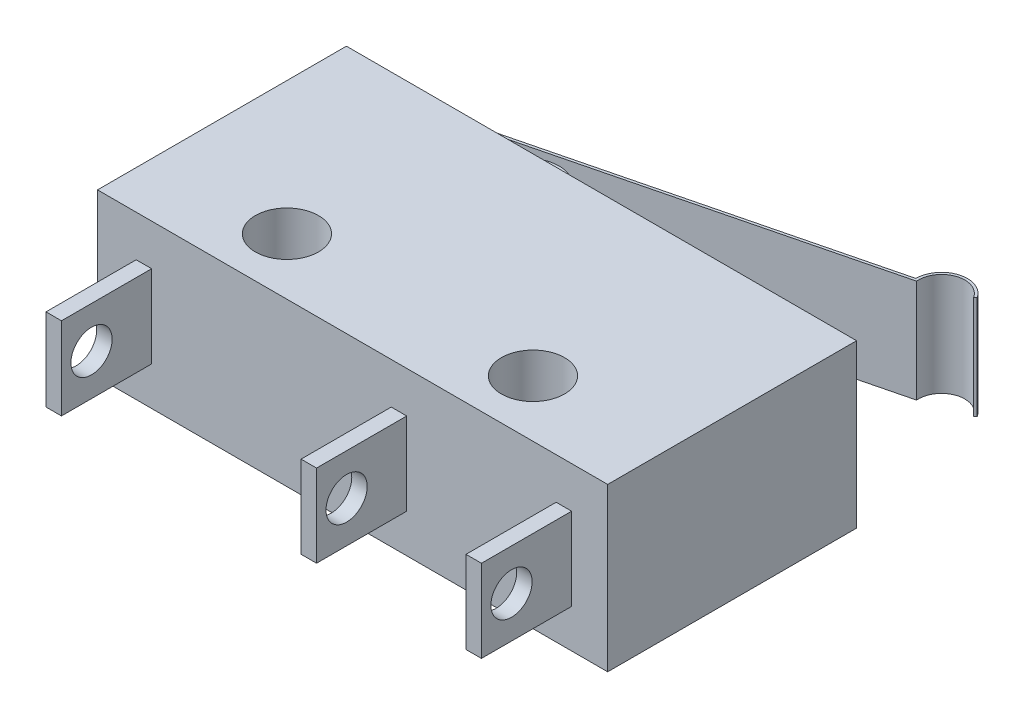
ISO-10303-21;
HEADER;
FILE_DESCRIPTION(('STEP AP214'),'2;1');
FILE_NAME('part.step','',(''),(''),'','','');
FILE_SCHEMA(('AUTOMOTIVE_DESIGN { 1 0 10303 214 1 1 1 1 }'));
ENDSEC;
DATA;
#1=APPLICATION_CONTEXT('core data for automotive mechanical design processes');
#2=APPLICATION_PROTOCOL_DEFINITION('international standard','automotive_design',2000,#1);
#3=PRODUCT_CONTEXT('',#1,'mechanical');
#4=PRODUCT('Part','Part','',(#3));
#5=PRODUCT_RELATED_PRODUCT_CATEGORY('part','',(#4));
#6=PRODUCT_DEFINITION_FORMATION('','',#4);
#7=PRODUCT_DEFINITION_CONTEXT('part definition',#1,'design');
#8=PRODUCT_DEFINITION('design','',#6,#7);
#9=PRODUCT_DEFINITION_SHAPE('','',#8);
#10=(LENGTH_UNIT() NAMED_UNIT(*) SI_UNIT(.MILLI.,.METRE.));
#11=(NAMED_UNIT(*) PLANE_ANGLE_UNIT() SI_UNIT($,.RADIAN.));
#12=(NAMED_UNIT(*) SI_UNIT($,.STERADIAN.) SOLID_ANGLE_UNIT());
#13=UNCERTAINTY_MEASURE_WITH_UNIT(LENGTH_MEASURE(1.E-05),#10,'distance_accuracy_value','');
#14=(GEOMETRIC_REPRESENTATION_CONTEXT(3) GLOBAL_UNCERTAINTY_ASSIGNED_CONTEXT((#13)) GLOBAL_UNIT_ASSIGNED_CONTEXT((#10,
#11,#12)) REPRESENTATION_CONTEXT('',''));
#15=CARTESIAN_POINT('',(0.,0.,0.));
#16=DIRECTION('',(0.,0.,1.));
#17=DIRECTION('',(1.,0.,0.));
#18=AXIS2_PLACEMENT_3D('',#15,#16,#17);
#19=CARTESIAN_POINT('',(-9.9,6.3,4.83));
#20=DIRECTION('',(0.,0.,-1.));
#21=DIRECTION('',(-1.,0.,0.));
#22=AXIS2_PLACEMENT_3D('',#19,#20,#21);
#23=PLANE('',#22);
#24=DIRECTION('',(0.,-1.,0.));
#25=VECTOR('',#24,1.);
#26=CARTESIAN_POINT('',(1.5,4.7,4.83));
#27=LINE('',#26,#25);
#28=CARTESIAN_POINT('',(1.5,4.7,4.83));
#29=VERTEX_POINT('',#28);
#30=CARTESIAN_POINT('',(1.5,1.5,4.83));
#31=VERTEX_POINT('',#30);
#32=EDGE_CURVE('E323',#29,#31,#27,.T.);
#33=ORIENTED_EDGE('',*,*,#32,.F.);
#34=DIRECTION('',(-1.,0.,0.));
#35=VECTOR('',#34,1.);
#36=CARTESIAN_POINT('',(1.5,4.7,4.83));
#37=LINE('',#36,#35);
#38=CARTESIAN_POINT('',(2.1,4.7,4.83));
#39=VERTEX_POINT('',#38);
#40=EDGE_CURVE('E328',#39,#29,#37,.T.);
#41=ORIENTED_EDGE('',*,*,#40,.F.);
#42=DIRECTION('',(0.,1.,0.));
#43=VECTOR('',#42,1.);
#44=CARTESIAN_POINT('',(2.1,4.7,4.83));
#45=LINE('',#44,#43);
#46=CARTESIAN_POINT('',(2.1,1.5,4.83));
#47=VERTEX_POINT('',#46);
#48=EDGE_CURVE('E340',#47,#39,#45,.T.);
#49=ORIENTED_EDGE('',*,*,#48,.F.);
#50=DIRECTION('',(1.,0.,0.));
#51=VECTOR('',#50,1.);
#52=CARTESIAN_POINT('',(1.5,1.5,4.83));
#53=LINE('',#52,#51);
#54=EDGE_CURVE('E337',#31,#47,#53,.T.);
#55=ORIENTED_EDGE('',*,*,#54,.F.);
#56=EDGE_LOOP('',(#33,#41,#49,#55));
#57=FACE_BOUND('',#56,.T.);
#58=DIRECTION('',(1.,0.,0.));
#59=VECTOR('',#58,1.);
#60=CARTESIAN_POINT('',(-9.9,0.,4.83));
#61=LINE('',#60,#59);
#62=CARTESIAN_POINT('',(-9.9,0.,4.83));
#63=VERTEX_POINT('',#62);
#64=CARTESIAN_POINT('',(9.9,0.,4.83));
#65=VERTEX_POINT('',#64);
#66=EDGE_CURVE('E406',#63,#65,#61,.T.);
#67=ORIENTED_EDGE('',*,*,#66,.T.);
#68=DIRECTION('',(0.,-1.,0.));
#69=VECTOR('',#68,1.);
#70=CARTESIAN_POINT('',(9.9,6.3,4.83));
#71=LINE('',#70,#69);
#72=CARTESIAN_POINT('',(9.9,6.3,4.83));
#73=VERTEX_POINT('',#72);
#74=EDGE_CURVE('E412',#73,#65,#71,.T.);
#75=ORIENTED_EDGE('',*,*,#74,.F.);
#76=DIRECTION('',(1.,0.,0.));
#77=VECTOR('',#76,1.);
#78=CARTESIAN_POINT('',(-9.9,6.3,4.83));
#79=LINE('',#78,#77);
#80=CARTESIAN_POINT('',(-9.9,6.3,4.83));
#81=VERTEX_POINT('',#80);
#82=EDGE_CURVE('E410',#81,#73,#79,.T.);
#83=ORIENTED_EDGE('',*,*,#82,.F.);
#84=DIRECTION('',(0.,-1.,0.));
#85=VECTOR('',#84,1.);
#86=CARTESIAN_POINT('',(-9.9,6.3,4.83));
#87=LINE('',#86,#85);
#88=EDGE_CURVE('E422',#81,#63,#87,.T.);
#89=ORIENTED_EDGE('',*,*,#88,.T.);
#90=EDGE_LOOP('',(#67,#75,#83,#89));
#91=FACE_BOUND('',#90,.T.);
#92=DIRECTION('',(0.,-1.,0.));
#93=VECTOR('',#92,1.);
#94=CARTESIAN_POINT('',(-8.4,4.7,4.83));
#95=LINE('',#94,#93);
#96=CARTESIAN_POINT('',(-8.4,4.7,4.83));
#97=VERTEX_POINT('',#96);
#98=CARTESIAN_POINT('',(-8.4,1.5,4.83));
#99=VERTEX_POINT('',#98);
#100=EDGE_CURVE('E356',#97,#99,#95,.T.);
#101=ORIENTED_EDGE('',*,*,#100,.F.);
#102=DIRECTION('',(-1.,0.,0.));
#103=VECTOR('',#102,1.);
#104=CARTESIAN_POINT('',(-8.4,4.7,4.83));
#105=LINE('',#104,#103);
#106=CARTESIAN_POINT('',(-7.80000000000001,4.7,4.83));
#107=VERTEX_POINT('',#106);
#108=EDGE_CURVE('E361',#107,#97,#105,.T.);
#109=ORIENTED_EDGE('',*,*,#108,.F.);
#110=DIRECTION('',(0.,1.,0.));
#111=VECTOR('',#110,1.);
#112=CARTESIAN_POINT('',(-7.80000000000001,4.7,4.83));
#113=LINE('',#112,#111);
#114=CARTESIAN_POINT('',(-7.80000000000001,1.5,4.83));
#115=VERTEX_POINT('',#114);
#116=EDGE_CURVE('E373',#115,#107,#113,.T.);
#117=ORIENTED_EDGE('',*,*,#116,.F.);
#118=DIRECTION('',(1.,0.,0.));
#119=VECTOR('',#118,1.);
#120=CARTESIAN_POINT('',(-8.4,1.5,4.83));
#121=LINE('',#120,#119);
#122=EDGE_CURVE('E370',#99,#115,#121,.T.);
#123=ORIENTED_EDGE('',*,*,#122,.F.);
#124=EDGE_LOOP('',(#101,#109,#117,#123));
#125=FACE_BOUND('',#124,.T.);
#126=DIRECTION('',(0.,-1.,0.));
#127=VECTOR('',#126,1.);
#128=CARTESIAN_POINT('',(7.9,4.7,4.83));
#129=LINE('',#128,#127);
#130=CARTESIAN_POINT('',(7.9,4.7,4.83));
#131=VERTEX_POINT('',#130);
#132=CARTESIAN_POINT('',(7.9,1.5,4.83));
#133=VERTEX_POINT('',#132);
#134=EDGE_CURVE('E290',#131,#133,#129,.T.);
#135=ORIENTED_EDGE('',*,*,#134,.F.);
#136=DIRECTION('',(-1.,0.,0.));
#137=VECTOR('',#136,1.);
#138=CARTESIAN_POINT('',(7.9,4.7,4.83));
#139=LINE('',#138,#137);
#140=CARTESIAN_POINT('',(8.49999999999999,4.7,4.83));
#141=VERTEX_POINT('',#140);
#142=EDGE_CURVE('E295',#141,#131,#139,.T.);
#143=ORIENTED_EDGE('',*,*,#142,.F.);
#144=DIRECTION('',(0.,1.,0.));
#145=VECTOR('',#144,1.);
#146=CARTESIAN_POINT('',(8.5,4.7,4.83));
#147=LINE('',#146,#145);
#148=CARTESIAN_POINT('',(8.5,1.5,4.83));
#149=VERTEX_POINT('',#148);
#150=EDGE_CURVE('E307',#149,#141,#147,.T.);
#151=ORIENTED_EDGE('',*,*,#150,.F.);
#152=DIRECTION('',(1.,0.,0.));
#153=VECTOR('',#152,1.);
#154=CARTESIAN_POINT('',(7.9,1.5,4.83));
#155=LINE('',#154,#153);
#156=EDGE_CURVE('E304',#133,#149,#155,.T.);
#157=ORIENTED_EDGE('',*,*,#156,.F.);
#158=EDGE_LOOP('',(#135,#143,#151,#157));
#159=FACE_BOUND('',#158,.T.);
#160=ADVANCED_FACE('F33',(#57,#91,#125,#159),#23,.F.);
#161=CARTESIAN_POINT('',(9.9,6.3,-4.83));
#162=DIRECTION('',(-1.,0.,0.));
#163=DIRECTION('',(0.,0.,1.));
#164=AXIS2_PLACEMENT_3D('',#161,#162,#163);
#165=PLANE('',#164);
#166=DIRECTION('',(0.,0.,-1.));
#167=VECTOR('',#166,1.);
#168=CARTESIAN_POINT('',(9.9,0.,-4.83));
#169=LINE('',#168,#167);
#170=CARTESIAN_POINT('',(9.9,0.,-4.83));
#171=VERTEX_POINT('',#170);
#172=EDGE_CURVE('E399',#65,#171,#169,.T.);
#173=ORIENTED_EDGE('',*,*,#172,.T.);
#174=DIRECTION('',(0.,-1.,0.));
#175=VECTOR('',#174,1.);
#176=CARTESIAN_POINT('',(9.9,6.3,-4.83));
#177=LINE('',#176,#175);
#178=CARTESIAN_POINT('',(9.9,6.3,-4.83));
#179=VERTEX_POINT('',#178);
#180=EDGE_CURVE('E428',#179,#171,#177,.T.);
#181=ORIENTED_EDGE('',*,*,#180,.F.);
#182=DIRECTION('',(0.,0.,-1.));
#183=VECTOR('',#182,1.);
#184=CARTESIAN_POINT('',(9.9,6.3,-4.83));
#185=LINE('',#184,#183);
#186=EDGE_CURVE('E402',#73,#179,#185,.T.);
#187=ORIENTED_EDGE('',*,*,#186,.F.);
#188=ORIENTED_EDGE('',*,*,#74,.T.);
#189=EDGE_LOOP('',(#173,#181,#187,#188));
#190=FACE_BOUND('',#189,.T.);
#191=ADVANCED_FACE('F35',(#190),#165,.F.);
#192=CARTESIAN_POINT('',(-9.9,6.3,-4.83));
#193=DIRECTION('',(0.,0.,1.));
#194=DIRECTION('',(1.,0.,0.));
#195=AXIS2_PLACEMENT_3D('',#192,#193,#194);
#196=PLANE('',#195);
#197=DIRECTION('',(0.,-1.,0.));
#198=VECTOR('',#197,1.);
#199=CARTESIAN_POINT('',(-7.79987486209516,5.15,-4.83));
#200=LINE('',#199,#198);
#201=CARTESIAN_POINT('',(-7.79987486209516,5.15,-4.83));
#202=VERTEX_POINT('',#201);
#203=CARTESIAN_POINT('',(-7.79987486209516,1.15,-4.83));
#204=VERTEX_POINT('',#203);
#205=EDGE_CURVE('E41',#202,#204,#200,.T.);
#206=ORIENTED_EDGE('',*,*,#205,.F.);
#207=DIRECTION('',(-1.,0.,0.));
#208=VECTOR('',#207,1.);
#209=CARTESIAN_POINT('',(-9.9,5.15,-4.83));
#210=LINE('',#209,#208);
#211=CARTESIAN_POINT('',(-7.9,5.15,-4.83));
#212=VERTEX_POINT('',#211);
#213=EDGE_CURVE('E11',#202,#212,#210,.T.);
#214=ORIENTED_EDGE('',*,*,#213,.T.);
#215=DIRECTION('',(0.,-1.,0.));
#216=VECTOR('',#215,1.);
#217=CARTESIAN_POINT('',(-7.9,5.15,-4.83));
#218=LINE('',#217,#216);
#219=CARTESIAN_POINT('',(-7.9,1.15,-4.83));
#220=VERTEX_POINT('',#219);
#221=EDGE_CURVE('E260',#212,#220,#218,.T.);
#222=ORIENTED_EDGE('',*,*,#221,.T.);
#223=DIRECTION('',(-1.,0.,0.));
#224=VECTOR('',#223,1.);
#225=CARTESIAN_POINT('',(-9.9,1.15,-4.83));
#226=LINE('',#225,#224);
#227=EDGE_CURVE('E442',#204,#220,#226,.T.);
#228=ORIENTED_EDGE('',*,*,#227,.F.);
#229=EDGE_LOOP('',(#206,#214,#222,#228));
#230=FACE_BOUND('',#229,.T.);
#231=DIRECTION('',(0.,-1.,0.));
#232=VECTOR('',#231,1.);
#233=CARTESIAN_POINT('',(-1.65,5.15,-4.83));
#234=LINE('',#233,#232);
#235=CARTESIAN_POINT('',(-1.65,5.15,-4.83));
#236=VERTEX_POINT('',#235);
#237=CARTESIAN_POINT('',(-1.65,1.15,-4.83));
#238=VERTEX_POINT('',#237);
#239=EDGE_CURVE('E434',#236,#238,#234,.T.);
#240=ORIENTED_EDGE('',*,*,#239,.F.);
#241=DIRECTION('',(-1.,0.,0.));
#242=VECTOR('',#241,1.);
#243=CARTESIAN_POINT('',(-9.9,5.15,-4.83));
#244=LINE('',#243,#242);
#245=CARTESIAN_POINT('',(-4.15,5.15,-4.83));
#246=VERTEX_POINT('',#245);
#247=EDGE_CURVE('E440',#236,#246,#244,.T.);
#248=ORIENTED_EDGE('',*,*,#247,.T.);
#249=DIRECTION('',(0.,-1.,0.));
#250=VECTOR('',#249,1.);
#251=CARTESIAN_POINT('',(-4.15,5.15,-4.83));
#252=LINE('',#251,#250);
#253=CARTESIAN_POINT('',(-4.15,1.15,-4.83));
#254=VERTEX_POINT('',#253);
#255=EDGE_CURVE('E437',#254,#246,#252,.F.);
#256=ORIENTED_EDGE('',*,*,#255,.F.);
#257=DIRECTION('',(-1.,0.,0.));
#258=VECTOR('',#257,1.);
#259=CARTESIAN_POINT('',(-9.9,1.15,-4.83));
#260=LINE('',#259,#258);
#261=EDGE_CURVE('E431',#238,#254,#260,.T.);
#262=ORIENTED_EDGE('',*,*,#261,.F.);
#263=EDGE_LOOP('',(#240,#248,#256,#262));
#264=FACE_BOUND('',#263,.T.);
#265=DIRECTION('',(-1.,0.,0.));
#266=VECTOR('',#265,1.);
#267=CARTESIAN_POINT('',(-9.9,0.,-4.83));
#268=LINE('',#267,#266);
#269=CARTESIAN_POINT('',(-9.9,0.,-4.83));
#270=VERTEX_POINT('',#269);
#271=EDGE_CURVE('E415',#171,#270,#268,.T.);
#272=ORIENTED_EDGE('',*,*,#271,.T.);
#273=DIRECTION('',(0.,-1.,0.));
#274=VECTOR('',#273,1.);
#275=CARTESIAN_POINT('',(-9.9,6.3,-4.83));
#276=LINE('',#275,#274);
#277=CARTESIAN_POINT('',(-9.9,6.3,-4.83));
#278=VERTEX_POINT('',#277);
#279=EDGE_CURVE('E425',#278,#270,#276,.T.);
#280=ORIENTED_EDGE('',*,*,#279,.F.);
#281=DIRECTION('',(-1.,0.,0.));
#282=VECTOR('',#281,1.);
#283=CARTESIAN_POINT('',(-9.9,6.3,-4.83));
#284=LINE('',#283,#282);
#285=EDGE_CURVE('E405',#179,#278,#284,.T.);
#286=ORIENTED_EDGE('',*,*,#285,.F.);
#287=ORIENTED_EDGE('',*,*,#180,.T.);
#288=EDGE_LOOP('',(#272,#280,#286,#287));
#289=FACE_BOUND('',#288,.T.);
#290=ADVANCED_FACE('F472',(#230,#264,#289),#196,.F.);
#291=CARTESIAN_POINT('',(-9.9,6.3,-4.83));
#292=DIRECTION('',(1.,0.,0.));
#293=DIRECTION('',(0.,0.,-1.));
#294=AXIS2_PLACEMENT_3D('',#291,#292,#293);
#295=PLANE('',#294);
#296=DIRECTION('',(0.,0.,1.));
#297=VECTOR('',#296,1.);
#298=CARTESIAN_POINT('',(-9.9,0.,-4.83));
#299=LINE('',#298,#297);
#300=EDGE_CURVE('E417',#270,#63,#299,.T.);
#301=ORIENTED_EDGE('',*,*,#300,.T.);
#302=ORIENTED_EDGE('',*,*,#88,.F.);
#303=DIRECTION('',(0.,0.,1.));
#304=VECTOR('',#303,1.);
#305=CARTESIAN_POINT('',(-9.9,6.3,-4.83));
#306=LINE('',#305,#304);
#307=EDGE_CURVE('E408',#278,#81,#306,.T.);
#308=ORIENTED_EDGE('',*,*,#307,.F.);
#309=ORIENTED_EDGE('',*,*,#279,.T.);
#310=EDGE_LOOP('',(#301,#302,#308,#309));
#311=FACE_BOUND('',#310,.T.);
#312=ADVANCED_FACE('F479',(#311),#295,.F.);
#313=CARTESIAN_POINT('',(0.,6.3,0.));
#314=DIRECTION('',(0.,1.,0.));
#315=DIRECTION('',(0.,0.,1.));
#316=AXIS2_PLACEMENT_3D('',#313,#314,#315);
#317=PLANE('',#316);
#318=CARTESIAN_POINT('',(4.8,6.3,2.63));
#319=DIRECTION('',(0.,1.,0.));
#320=DIRECTION('',(0.,0.,1.));
#321=AXIS2_PLACEMENT_3D('',#318,#319,#320);
#322=CIRCLE('',#321,1.225);
#323=CARTESIAN_POINT('',(4.8,6.3,3.855));
#324=VERTEX_POINT('',#323);
#325=EDGE_CURVE('E389',#324,#324,#322,.T.);
#326=ORIENTED_EDGE('',*,*,#325,.F.);
#327=EDGE_LOOP('',(#326));
#328=FACE_BOUND('',#327,.T.);
#329=CARTESIAN_POINT('',(-4.75,6.3,2.63));
#330=DIRECTION('',(0.,1.,0.));
#331=DIRECTION('',(0.,0.,1.));
#332=AXIS2_PLACEMENT_3D('',#329,#330,#331);
#333=CIRCLE('',#332,1.225);
#334=CARTESIAN_POINT('',(-4.75,6.3,3.855));
#335=VERTEX_POINT('',#334);
#336=EDGE_CURVE('E393',#335,#335,#333,.T.);
#337=ORIENTED_EDGE('',*,*,#336,.F.);
#338=EDGE_LOOP('',(#337));
#339=FACE_BOUND('',#338,.T.);
#340=ORIENTED_EDGE('',*,*,#186,.T.);
#341=ORIENTED_EDGE('',*,*,#285,.T.);
#342=ORIENTED_EDGE('',*,*,#307,.T.);
#343=ORIENTED_EDGE('',*,*,#82,.T.);
#344=EDGE_LOOP('',(#340,#341,#342,#343));
#345=FACE_BOUND('',#344,.T.);
#346=ADVANCED_FACE('F481',(#328,#339,#345),#317,.T.);
#347=CARTESIAN_POINT('',(0.,0.,0.));
#348=DIRECTION('',(0.,1.,0.));
#349=DIRECTION('',(0.,0.,1.));
#350=AXIS2_PLACEMENT_3D('',#347,#348,#349);
#351=PLANE('',#350);
#352=CARTESIAN_POINT('',(4.8,0.,2.63));
#353=DIRECTION('',(0.,1.,0.));
#354=DIRECTION('',(0.,0.,1.));
#355=AXIS2_PLACEMENT_3D('',#352,#353,#354);
#356=CIRCLE('',#355,1.225);
#357=CARTESIAN_POINT('',(4.8,0.,3.855));
#358=VERTEX_POINT('',#357);
#359=EDGE_CURVE('E390',#358,#358,#356,.T.);
#360=ORIENTED_EDGE('',*,*,#359,.T.);
#361=EDGE_LOOP('',(#360));
#362=FACE_BOUND('',#361,.T.);
#363=CARTESIAN_POINT('',(-4.75,0.,2.63));
#364=DIRECTION('',(0.,1.,0.));
#365=DIRECTION('',(0.,0.,1.));
#366=AXIS2_PLACEMENT_3D('',#363,#364,#365);
#367=CIRCLE('',#366,1.225);
#368=CARTESIAN_POINT('',(-4.75,0.,3.855));
#369=VERTEX_POINT('',#368);
#370=EDGE_CURVE('E396',#369,#369,#367,.T.);
#371=ORIENTED_EDGE('',*,*,#370,.T.);
#372=EDGE_LOOP('',(#371));
#373=FACE_BOUND('',#372,.T.);
#374=ORIENTED_EDGE('',*,*,#172,.F.);
#375=ORIENTED_EDGE('',*,*,#66,.F.);
#376=ORIENTED_EDGE('',*,*,#300,.F.);
#377=ORIENTED_EDGE('',*,*,#271,.F.);
#378=EDGE_LOOP('',(#374,#375,#376,#377));
#379=FACE_BOUND('',#378,.T.);
#380=ADVANCED_FACE('F477',(#362,#373,#379),#351,.F.);
#381=CARTESIAN_POINT('',(-4.75,0.,2.63));
#382=DIRECTION('',(0.,1.,0.));
#383=DIRECTION('',(0.,0.,1.));
#384=AXIS2_PLACEMENT_3D('',#381,#382,#383);
#385=CYLINDRICAL_SURFACE('',#384,1.225);
#386=ORIENTED_EDGE('',*,*,#370,.F.);
#387=EDGE_LOOP('',(#386));
#388=FACE_BOUND('',#387,.T.);
#389=ORIENTED_EDGE('',*,*,#336,.T.);
#390=EDGE_LOOP('',(#389));
#391=FACE_BOUND('',#390,.T.);
#392=ADVANCED_FACE('F507',(#388,#391),#385,.F.);
#393=CARTESIAN_POINT('',(4.8,0.,2.63));
#394=DIRECTION('',(0.,1.,0.));
#395=DIRECTION('',(0.,0.,1.));
#396=AXIS2_PLACEMENT_3D('',#393,#394,#395);
#397=CYLINDRICAL_SURFACE('',#396,1.225);
#398=ORIENTED_EDGE('',*,*,#359,.F.);
#399=EDGE_LOOP('',(#398));
#400=FACE_BOUND('',#399,.T.);
#401=ORIENTED_EDGE('',*,*,#325,.T.);
#402=EDGE_LOOP('',(#401));
#403=FACE_BOUND('',#402,.T.);
#404=ADVANCED_FACE('F514',(#400,#403),#397,.F.);
#405=CARTESIAN_POINT('',(-8.4,4.7,8.33));
#406=DIRECTION('',(1.,0.,0.));
#407=DIRECTION('',(0.,1.,0.));
#408=AXIS2_PLACEMENT_3D('',#405,#406,#407);
#409=PLANE('',#408);
#410=CARTESIAN_POINT('',(-8.4,3.1,7.16296276064333));
#411=DIRECTION('',(1.,0.,0.));
#412=DIRECTION('',(0.,1.,0.));
#413=AXIS2_PLACEMENT_3D('',#410,#411,#412);
#414=CIRCLE('',#413,0.800000000000001);
#415=CARTESIAN_POINT('',(-8.4,3.9,7.16296276064333));
#416=VERTEX_POINT('',#415);
#417=EDGE_CURVE('E287',#416,#416,#414,.T.);
#418=ORIENTED_EDGE('',*,*,#417,.T.);
#419=EDGE_LOOP('',(#418));
#420=FACE_BOUND('',#419,.T.);
#421=ORIENTED_EDGE('',*,*,#100,.T.);
#422=DIRECTION('',(0.,0.,-1.));
#423=VECTOR('',#422,1.);
#424=CARTESIAN_POINT('',(-8.4,1.5,8.33));
#425=LINE('',#424,#423);
#426=CARTESIAN_POINT('',(-8.4,1.5,8.33));
#427=VERTEX_POINT('',#426);
#428=EDGE_CURVE('E386',#427,#99,#425,.T.);
#429=ORIENTED_EDGE('',*,*,#428,.F.);
#430=DIRECTION('',(0.,-1.,0.));
#431=VECTOR('',#430,1.);
#432=CARTESIAN_POINT('',(-8.4,4.7,8.33));
#433=LINE('',#432,#431);
#434=CARTESIAN_POINT('',(-8.4,4.7,8.33));
#435=VERTEX_POINT('',#434);
#436=EDGE_CURVE('E357',#435,#427,#433,.T.);
#437=ORIENTED_EDGE('',*,*,#436,.F.);
#438=DIRECTION('',(0.,0.,-1.));
#439=VECTOR('',#438,1.);
#440=CARTESIAN_POINT('',(-8.4,4.7,8.33));
#441=LINE('',#440,#439);
#442=EDGE_CURVE('E367',#435,#97,#441,.T.);
#443=ORIENTED_EDGE('',*,*,#442,.T.);
#444=EDGE_LOOP('',(#421,#429,#437,#443));
#445=FACE_BOUND('',#444,.T.);
#446=ADVANCED_FACE('F518',(#420,#445),#409,.F.);
#447=CARTESIAN_POINT('',(-8.4,1.5,8.33));
#448=DIRECTION('',(0.,1.,0.));
#449=DIRECTION('',(0.,0.,1.));
#450=AXIS2_PLACEMENT_3D('',#447,#448,#449);
#451=PLANE('',#450);
#452=ORIENTED_EDGE('',*,*,#122,.T.);
#453=DIRECTION('',(0.,0.,-1.));
#454=VECTOR('',#453,1.);
#455=CARTESIAN_POINT('',(-7.80000000000001,1.5,8.33));
#456=LINE('',#455,#454);
#457=CARTESIAN_POINT('',(-7.80000000000001,1.5,8.33));
#458=VERTEX_POINT('',#457);
#459=EDGE_CURVE('E383',#458,#115,#456,.T.);
#460=ORIENTED_EDGE('',*,*,#459,.F.);
#461=DIRECTION('',(1.,0.,0.));
#462=VECTOR('',#461,1.);
#463=CARTESIAN_POINT('',(-8.4,1.5,8.33));
#464=LINE('',#463,#462);
#465=EDGE_CURVE('E360',#427,#458,#464,.T.);
#466=ORIENTED_EDGE('',*,*,#465,.F.);
#467=ORIENTED_EDGE('',*,*,#428,.T.);
#468=EDGE_LOOP('',(#452,#460,#466,#467));
#469=FACE_BOUND('',#468,.T.);
#470=ADVANCED_FACE('F522',(#469),#451,.F.);
#471=CARTESIAN_POINT('',(-7.80000000000001,4.7,8.33));
#472=DIRECTION('',(-1.,0.,0.));
#473=DIRECTION('',(0.,0.,1.));
#474=AXIS2_PLACEMENT_3D('',#471,#472,#473);
#475=PLANE('',#474);
#476=CARTESIAN_POINT('',(-7.80000000000001,3.1,7.16296276064333));
#477=DIRECTION('',(-1.,0.,0.));
#478=DIRECTION('',(0.,0.,1.));
#479=AXIS2_PLACEMENT_3D('',#476,#477,#478);
#480=CIRCLE('',#479,0.800000000000001);
#481=CARTESIAN_POINT('',(-7.80000000000001,3.1,7.96296276064333));
#482=VERTEX_POINT('',#481);
#483=EDGE_CURVE('E284',#482,#482,#480,.T.);
#484=ORIENTED_EDGE('',*,*,#483,.T.);
#485=EDGE_LOOP('',(#484));
#486=FACE_BOUND('',#485,.T.);
#487=ORIENTED_EDGE('',*,*,#116,.T.);
#488=DIRECTION('',(0.,0.,-1.));
#489=VECTOR('',#488,1.);
#490=CARTESIAN_POINT('',(-7.80000000000001,4.7,8.33));
#491=LINE('',#490,#489);
#492=CARTESIAN_POINT('',(-7.80000000000001,4.7,8.33));
#493=VERTEX_POINT('',#492);
#494=EDGE_CURVE('E380',#493,#107,#491,.T.);
#495=ORIENTED_EDGE('',*,*,#494,.F.);
#496=DIRECTION('',(0.,1.,0.));
#497=VECTOR('',#496,1.);
#498=CARTESIAN_POINT('',(-7.80000000000001,4.7,8.33));
#499=LINE('',#498,#497);
#500=EDGE_CURVE('E363',#458,#493,#499,.T.);
#501=ORIENTED_EDGE('',*,*,#500,.F.);
#502=ORIENTED_EDGE('',*,*,#459,.T.);
#503=EDGE_LOOP('',(#487,#495,#501,#502));
#504=FACE_BOUND('',#503,.T.);
#505=ADVANCED_FACE('F526',(#486,#504),#475,.F.);
#506=CARTESIAN_POINT('',(-8.4,4.7,8.33));
#507=DIRECTION('',(0.,-1.,0.));
#508=DIRECTION('',(1.,0.,0.));
#509=AXIS2_PLACEMENT_3D('',#506,#507,#508);
#510=PLANE('',#509);
#511=ORIENTED_EDGE('',*,*,#108,.T.);
#512=ORIENTED_EDGE('',*,*,#442,.F.);
#513=DIRECTION('',(-1.,0.,0.));
#514=VECTOR('',#513,1.);
#515=CARTESIAN_POINT('',(-8.4,4.7,8.33));
#516=LINE('',#515,#514);
#517=EDGE_CURVE('E365',#493,#435,#516,.T.);
#518=ORIENTED_EDGE('',*,*,#517,.F.);
#519=ORIENTED_EDGE('',*,*,#494,.T.);
#520=EDGE_LOOP('',(#511,#512,#518,#519));
#521=FACE_BOUND('',#520,.T.);
#522=ADVANCED_FACE('F530',(#521),#510,.F.);
#523=CARTESIAN_POINT('',(0.,0.,8.33));
#524=DIRECTION('',(0.,0.,1.));
#525=DIRECTION('',(1.,0.,0.));
#526=AXIS2_PLACEMENT_3D('',#523,#524,#525);
#527=PLANE('',#526);
#528=ORIENTED_EDGE('',*,*,#436,.T.);
#529=ORIENTED_EDGE('',*,*,#465,.T.);
#530=ORIENTED_EDGE('',*,*,#500,.T.);
#531=ORIENTED_EDGE('',*,*,#517,.T.);
#532=EDGE_LOOP('',(#528,#529,#530,#531));
#533=FACE_BOUND('',#532,.T.);
#534=ADVANCED_FACE('F534',(#533),#527,.T.);
#535=CARTESIAN_POINT('',(1.5,4.7,8.33));
#536=DIRECTION('',(1.,0.,0.));
#537=DIRECTION('',(0.,0.,-1.));
#538=AXIS2_PLACEMENT_3D('',#535,#536,#537);
#539=PLANE('',#538);
#540=CARTESIAN_POINT('',(1.5,3.1,7.16296276064333));
#541=DIRECTION('',(1.,0.,0.));
#542=DIRECTION('',(0.,0.,-1.));
#543=AXIS2_PLACEMENT_3D('',#540,#541,#542);
#544=CIRCLE('',#543,0.800000000000001);
#545=CARTESIAN_POINT('',(1.5,3.1,6.36296276064333));
#546=VERTEX_POINT('',#545);
#547=EDGE_CURVE('E281',#546,#546,#544,.T.);
#548=ORIENTED_EDGE('',*,*,#547,.T.);
#549=EDGE_LOOP('',(#548));
#550=FACE_BOUND('',#549,.T.);
#551=ORIENTED_EDGE('',*,*,#32,.T.);
#552=DIRECTION('',(0.,0.,-1.));
#553=VECTOR('',#552,1.);
#554=CARTESIAN_POINT('',(1.5,1.5,8.33));
#555=LINE('',#554,#553);
#556=CARTESIAN_POINT('',(1.5,1.5,8.33));
#557=VERTEX_POINT('',#556);
#558=EDGE_CURVE('E353',#557,#31,#555,.T.);
#559=ORIENTED_EDGE('',*,*,#558,.F.);
#560=DIRECTION('',(0.,-1.,0.));
#561=VECTOR('',#560,1.);
#562=CARTESIAN_POINT('',(1.5,4.7,8.33));
#563=LINE('',#562,#561);
#564=CARTESIAN_POINT('',(1.5,4.7,8.33));
#565=VERTEX_POINT('',#564);
#566=EDGE_CURVE('E324',#565,#557,#563,.T.);
#567=ORIENTED_EDGE('',*,*,#566,.F.);
#568=DIRECTION('',(0.,0.,-1.));
#569=VECTOR('',#568,1.);
#570=CARTESIAN_POINT('',(1.5,4.7,8.33));
#571=LINE('',#570,#569);
#572=EDGE_CURVE('E334',#565,#29,#571,.T.);
#573=ORIENTED_EDGE('',*,*,#572,.T.);
#574=EDGE_LOOP('',(#551,#559,#567,#573));
#575=FACE_BOUND('',#574,.T.);
#576=ADVANCED_FACE('F538',(#550,#575),#539,.F.);
#577=CARTESIAN_POINT('',(1.5,1.5,8.33));
#578=DIRECTION('',(0.,1.,0.));
#579=DIRECTION('',(0.,0.,1.));
#580=AXIS2_PLACEMENT_3D('',#577,#578,#579);
#581=PLANE('',#580);
#582=ORIENTED_EDGE('',*,*,#54,.T.);
#583=DIRECTION('',(0.,0.,-1.));
#584=VECTOR('',#583,1.);
#585=CARTESIAN_POINT('',(2.1,1.5,8.33));
#586=LINE('',#585,#584);
#587=CARTESIAN_POINT('',(2.1,1.5,8.33));
#588=VERTEX_POINT('',#587);
#589=EDGE_CURVE('E350',#588,#47,#586,.T.);
#590=ORIENTED_EDGE('',*,*,#589,.F.);
#591=DIRECTION('',(1.,0.,0.));
#592=VECTOR('',#591,1.);
#593=CARTESIAN_POINT('',(1.5,1.5,8.33));
#594=LINE('',#593,#592);
#595=EDGE_CURVE('E327',#557,#588,#594,.T.);
#596=ORIENTED_EDGE('',*,*,#595,.F.);
#597=ORIENTED_EDGE('',*,*,#558,.T.);
#598=EDGE_LOOP('',(#582,#590,#596,#597));
#599=FACE_BOUND('',#598,.T.);
#600=ADVANCED_FACE('F542',(#599),#581,.F.);
#601=CARTESIAN_POINT('',(2.1,4.7,8.33));
#602=DIRECTION('',(-1.,0.,0.));
#603=DIRECTION('',(0.,-1.,0.));
#604=AXIS2_PLACEMENT_3D('',#601,#602,#603);
#605=PLANE('',#604);
#606=CARTESIAN_POINT('',(2.1,3.1,7.16296276064333));
#607=DIRECTION('',(-1.,0.,0.));
#608=DIRECTION('',(0.,-1.,0.));
#609=AXIS2_PLACEMENT_3D('',#606,#607,#608);
#610=CIRCLE('',#609,0.800000000000001);
#611=CARTESIAN_POINT('',(2.1,2.3,7.16296276064333));
#612=VERTEX_POINT('',#611);
#613=EDGE_CURVE('E278',#612,#612,#610,.T.);
#614=ORIENTED_EDGE('',*,*,#613,.T.);
#615=EDGE_LOOP('',(#614));
#616=FACE_BOUND('',#615,.T.);
#617=ORIENTED_EDGE('',*,*,#48,.T.);
#618=DIRECTION('',(0.,0.,-1.));
#619=VECTOR('',#618,1.);
#620=CARTESIAN_POINT('',(2.1,4.7,8.33));
#621=LINE('',#620,#619);
#622=CARTESIAN_POINT('',(2.1,4.7,8.33));
#623=VERTEX_POINT('',#622);
#624=EDGE_CURVE('E347',#623,#39,#621,.T.);
#625=ORIENTED_EDGE('',*,*,#624,.F.);
#626=DIRECTION('',(0.,1.,0.));
#627=VECTOR('',#626,1.);
#628=CARTESIAN_POINT('',(2.1,4.7,8.33));
#629=LINE('',#628,#627);
#630=EDGE_CURVE('E330',#588,#623,#629,.T.);
#631=ORIENTED_EDGE('',*,*,#630,.F.);
#632=ORIENTED_EDGE('',*,*,#589,.T.);
#633=EDGE_LOOP('',(#617,#625,#631,#632));
#634=FACE_BOUND('',#633,.T.);
#635=ADVANCED_FACE('F546',(#616,#634),#605,.F.);
#636=CARTESIAN_POINT('',(1.5,4.7,8.33));
#637=DIRECTION('',(0.,-1.,0.));
#638=DIRECTION('',(0.,0.,-1.));
#639=AXIS2_PLACEMENT_3D('',#636,#637,#638);
#640=PLANE('',#639);
#641=ORIENTED_EDGE('',*,*,#40,.T.);
#642=ORIENTED_EDGE('',*,*,#572,.F.);
#643=DIRECTION('',(-1.,0.,0.));
#644=VECTOR('',#643,1.);
#645=CARTESIAN_POINT('',(1.5,4.7,8.33));
#646=LINE('',#645,#644);
#647=EDGE_CURVE('E332',#623,#565,#646,.T.);
#648=ORIENTED_EDGE('',*,*,#647,.F.);
#649=ORIENTED_EDGE('',*,*,#624,.T.);
#650=EDGE_LOOP('',(#641,#642,#648,#649));
#651=FACE_BOUND('',#650,.T.);
#652=ADVANCED_FACE('F550',(#651),#640,.F.);
#653=CARTESIAN_POINT('',(0.,0.,8.33));
#654=DIRECTION('',(0.,0.,1.));
#655=DIRECTION('',(1.,0.,0.));
#656=AXIS2_PLACEMENT_3D('',#653,#654,#655);
#657=PLANE('',#656);
#658=ORIENTED_EDGE('',*,*,#566,.T.);
#659=ORIENTED_EDGE('',*,*,#595,.T.);
#660=ORIENTED_EDGE('',*,*,#630,.T.);
#661=ORIENTED_EDGE('',*,*,#647,.T.);
#662=EDGE_LOOP('',(#658,#659,#660,#661));
#663=FACE_BOUND('',#662,.T.);
#664=ADVANCED_FACE('F554',(#663),#657,.T.);
#665=CARTESIAN_POINT('',(7.9,4.7,8.33));
#666=DIRECTION('',(1.,0.,0.));
#667=DIRECTION('',(0.,1.,0.));
#668=AXIS2_PLACEMENT_3D('',#665,#666,#667);
#669=PLANE('',#668);
#670=CARTESIAN_POINT('',(7.9,3.1,7.16296276064333));
#671=DIRECTION('',(1.,0.,0.));
#672=DIRECTION('',(0.,1.,0.));
#673=AXIS2_PLACEMENT_3D('',#670,#671,#672);
#674=CIRCLE('',#673,0.800000000000001);
#675=CARTESIAN_POINT('',(7.9,3.9,7.16296276064333));
#676=VERTEX_POINT('',#675);
#677=EDGE_CURVE('E275',#676,#676,#674,.T.);
#678=ORIENTED_EDGE('',*,*,#677,.T.);
#679=EDGE_LOOP('',(#678));
#680=FACE_BOUND('',#679,.T.);
#681=ORIENTED_EDGE('',*,*,#134,.T.);
#682=DIRECTION('',(0.,0.,-1.));
#683=VECTOR('',#682,1.);
#684=CARTESIAN_POINT('',(7.9,1.5,8.33));
#685=LINE('',#684,#683);
#686=CARTESIAN_POINT('',(7.9,1.5,8.33));
#687=VERTEX_POINT('',#686);
#688=EDGE_CURVE('E320',#687,#133,#685,.T.);
#689=ORIENTED_EDGE('',*,*,#688,.F.);
#690=DIRECTION('',(0.,-1.,0.));
#691=VECTOR('',#690,1.);
#692=CARTESIAN_POINT('',(7.9,4.7,8.33));
#693=LINE('',#692,#691);
#694=CARTESIAN_POINT('',(7.9,4.7,8.33));
#695=VERTEX_POINT('',#694);
#696=EDGE_CURVE('E291',#695,#687,#693,.T.);
#697=ORIENTED_EDGE('',*,*,#696,.F.);
#698=DIRECTION('',(0.,0.,-1.));
#699=VECTOR('',#698,1.);
#700=CARTESIAN_POINT('',(7.9,4.7,8.33));
#701=LINE('',#700,#699);
#702=EDGE_CURVE('E301',#695,#131,#701,.T.);
#703=ORIENTED_EDGE('',*,*,#702,.T.);
#704=EDGE_LOOP('',(#681,#689,#697,#703));
#705=FACE_BOUND('',#704,.T.);
#706=ADVANCED_FACE('F558',(#680,#705),#669,.F.);
#707=CARTESIAN_POINT('',(7.9,1.5,8.33));
#708=DIRECTION('',(0.,1.,0.));
#709=DIRECTION('',(0.,0.,1.));
#710=AXIS2_PLACEMENT_3D('',#707,#708,#709);
#711=PLANE('',#710);
#712=ORIENTED_EDGE('',*,*,#156,.T.);
#713=DIRECTION('',(0.,0.,-1.));
#714=VECTOR('',#713,1.);
#715=CARTESIAN_POINT('',(8.5,1.5,8.33));
#716=LINE('',#715,#714);
#717=CARTESIAN_POINT('',(8.5,1.5,8.33));
#718=VERTEX_POINT('',#717);
#719=EDGE_CURVE('E317',#718,#149,#716,.T.);
#720=ORIENTED_EDGE('',*,*,#719,.F.);
#721=DIRECTION('',(1.,0.,0.));
#722=VECTOR('',#721,1.);
#723=CARTESIAN_POINT('',(7.9,1.5,8.33));
#724=LINE('',#723,#722);
#725=EDGE_CURVE('E294',#687,#718,#724,.T.);
#726=ORIENTED_EDGE('',*,*,#725,.F.);
#727=ORIENTED_EDGE('',*,*,#688,.T.);
#728=EDGE_LOOP('',(#712,#720,#726,#727));
#729=FACE_BOUND('',#728,.T.);
#730=ADVANCED_FACE('F562',(#729),#711,.F.);
#731=CARTESIAN_POINT('',(8.5,4.7,8.33));
#732=DIRECTION('',(-1.,0.,0.));
#733=DIRECTION('',(0.,0.,1.));
#734=AXIS2_PLACEMENT_3D('',#731,#732,#733);
#735=PLANE('',#734);
#736=CARTESIAN_POINT('',(8.5,3.1,7.16296276064333));
#737=DIRECTION('',(1.,0.,0.));
#738=DIRECTION('',(0.,0.,-1.));
#739=AXIS2_PLACEMENT_3D('',#736,#737,#738);
#740=CIRCLE('',#739,0.800000000000001);
#741=CARTESIAN_POINT('',(8.5,3.1,6.36296276064333));
#742=VERTEX_POINT('',#741);
#743=EDGE_CURVE('E270',#742,#742,#740,.T.);
#744=ORIENTED_EDGE('',*,*,#743,.F.);
#745=EDGE_LOOP('',(#744));
#746=FACE_BOUND('',#745,.T.);
#747=ORIENTED_EDGE('',*,*,#150,.T.);
#748=DIRECTION('',(0.,0.,-1.));
#749=VECTOR('',#748,1.);
#750=CARTESIAN_POINT('',(8.5,4.7,8.33));
#751=LINE('',#750,#749);
#752=CARTESIAN_POINT('',(8.5,4.7,8.33));
#753=VERTEX_POINT('',#752);
#754=EDGE_CURVE('E314',#753,#141,#751,.T.);
#755=ORIENTED_EDGE('',*,*,#754,.F.);
#756=DIRECTION('',(0.,1.,0.));
#757=VECTOR('',#756,1.);
#758=CARTESIAN_POINT('',(8.5,4.7,8.33));
#759=LINE('',#758,#757);
#760=EDGE_CURVE('E297',#718,#753,#759,.T.);
#761=ORIENTED_EDGE('',*,*,#760,.F.);
#762=ORIENTED_EDGE('',*,*,#719,.T.);
#763=EDGE_LOOP('',(#747,#755,#761,#762));
#764=FACE_BOUND('',#763,.T.);
#765=ADVANCED_FACE('F566',(#746,#764),#735,.F.);
#766=CARTESIAN_POINT('',(7.9,4.7,8.33));
#767=DIRECTION('',(0.,-1.,0.));
#768=DIRECTION('',(1.,0.,0.));
#769=AXIS2_PLACEMENT_3D('',#766,#767,#768);
#770=PLANE('',#769);
#771=ORIENTED_EDGE('',*,*,#142,.T.);
#772=ORIENTED_EDGE('',*,*,#702,.F.);
#773=DIRECTION('',(-1.,0.,0.));
#774=VECTOR('',#773,1.);
#775=CARTESIAN_POINT('',(7.9,4.7,8.33));
#776=LINE('',#775,#774);
#777=EDGE_CURVE('E299',#753,#695,#776,.T.);
#778=ORIENTED_EDGE('',*,*,#777,.F.);
#779=ORIENTED_EDGE('',*,*,#754,.T.);
#780=EDGE_LOOP('',(#771,#772,#778,#779));
#781=FACE_BOUND('',#780,.T.);
#782=ADVANCED_FACE('F570',(#781),#770,.F.);
#783=CARTESIAN_POINT('',(0.,0.,8.33));
#784=DIRECTION('',(0.,0.,1.));
#785=DIRECTION('',(1.,0.,0.));
#786=AXIS2_PLACEMENT_3D('',#783,#784,#785);
#787=PLANE('',#786);
#788=ORIENTED_EDGE('',*,*,#696,.T.);
#789=ORIENTED_EDGE('',*,*,#725,.T.);
#790=ORIENTED_EDGE('',*,*,#760,.T.);
#791=ORIENTED_EDGE('',*,*,#777,.T.);
#792=EDGE_LOOP('',(#788,#789,#790,#791));
#793=FACE_BOUND('',#792,.T.);
#794=ADVANCED_FACE('F574',(#793),#787,.T.);
#795=CARTESIAN_POINT('',(-9.9,3.1,7.16296276064333));
#796=DIRECTION('',(1.,0.,0.));
#797=DIRECTION('',(0.,0.,-1.));
#798=AXIS2_PLACEMENT_3D('',#795,#796,#797);
#799=CYLINDRICAL_SURFACE('',#798,0.800000000000001);
#800=ORIENTED_EDGE('',*,*,#743,.T.);
#801=EDGE_LOOP('',(#800));
#802=FACE_BOUND('',#801,.T.);
#803=ORIENTED_EDGE('',*,*,#677,.F.);
#804=EDGE_LOOP('',(#803));
#805=FACE_BOUND('',#804,.T.);
#806=ADVANCED_FACE('F578',(#802,#805),#799,.F.);
#807=ORIENTED_EDGE('',*,*,#613,.F.);
#808=EDGE_LOOP('',(#807));
#809=FACE_BOUND('',#808,.T.);
#810=ORIENTED_EDGE('',*,*,#547,.F.);
#811=EDGE_LOOP('',(#810));
#812=FACE_BOUND('',#811,.T.);
#813=ADVANCED_FACE('F584',(#809,#812),#799,.F.);
#814=ORIENTED_EDGE('',*,*,#483,.F.);
#815=EDGE_LOOP('',(#814));
#816=FACE_BOUND('',#815,.T.);
#817=ORIENTED_EDGE('',*,*,#417,.F.);
#818=EDGE_LOOP('',(#817));
#819=FACE_BOUND('',#818,.T.);
#820=ADVANCED_FACE('F580',(#816,#819),#799,.F.);
#821=CARTESIAN_POINT('',(-2.9,5.15,-4.83));
#822=DIRECTION('',(0.,-1.,0.));
#823=DIRECTION('',(0.,0.,-1.));
#824=AXIS2_PLACEMENT_3D('',#821,#822,#823);
#825=CYLINDRICAL_SURFACE('',#824,1.25);
#826=CARTESIAN_POINT('',(-2.9,1.15,-4.83));
#827=DIRECTION('',(0.,1.,0.));
#828=DIRECTION('',(0.,0.,1.));
#829=AXIS2_PLACEMENT_3D('',#826,#827,#828);
#830=CIRCLE('',#829,1.25);
#831=EDGE_CURVE('E223',#238,#254,#830,.T.);
#832=ORIENTED_EDGE('',*,*,#831,.T.);
#833=ORIENTED_EDGE('',*,*,#255,.T.);
#834=CARTESIAN_POINT('',(-2.9,5.15,-4.83));
#835=DIRECTION('',(0.,1.,0.));
#836=DIRECTION('',(0.,0.,1.));
#837=AXIS2_PLACEMENT_3D('',#834,#835,#836);
#838=CIRCLE('',#837,1.25);
#839=EDGE_CURVE('E267',#236,#246,#838,.T.);
#840=ORIENTED_EDGE('',*,*,#839,.F.);
#841=ORIENTED_EDGE('',*,*,#239,.T.);
#842=EDGE_LOOP('',(#832,#833,#840,#841));
#843=FACE_BOUND('',#842,.T.);
#844=ADVANCED_FACE('F583',(#843),#825,.T.);
#845=CARTESIAN_POINT('',(-2.9,5.15,-4.83));
#846=DIRECTION('',(0.,1.,0.));
#847=DIRECTION('',(0.,0.,1.));
#848=AXIS2_PLACEMENT_3D('',#845,#846,#847);
#849=PLANE('',#848);
#850=ORIENTED_EDGE('',*,*,#247,.F.);
#851=ORIENTED_EDGE('',*,*,#839,.T.);
#852=EDGE_LOOP('',(#850,#851));
#853=FACE_BOUND('',#852,.T.);
#854=ADVANCED_FACE('F588',(#853),#849,.T.);
#855=CARTESIAN_POINT('',(-2.9,1.15,-4.83));
#856=DIRECTION('',(0.,1.,0.));
#857=DIRECTION('',(0.,0.,1.));
#858=AXIS2_PLACEMENT_3D('',#855,#856,#857);
#859=PLANE('',#858);
#860=ORIENTED_EDGE('',*,*,#831,.F.);
#861=ORIENTED_EDGE('',*,*,#261,.T.);
#862=EDGE_LOOP('',(#860,#861));
#863=FACE_BOUND('',#862,.T.);
#864=ADVANCED_FACE('F590',(#863),#859,.F.);
#865=CARTESIAN_POINT('',(-7.25156476821188,5.15,-4.80016022749614));
#866=DIRECTION('',(0.,-1.,0.));
#867=DIRECTION('',(0.,0.,-1.));
#868=AXIS2_PLACEMENT_3D('',#865,#866,#867);
#869=CYLINDRICAL_SURFACE('',#868,0.549121453849119);
#870=CARTESIAN_POINT('',(-7.25156476821188,5.15,-4.80016022749614));
#871=DIRECTION('',(0.,1.,0.));
#872=DIRECTION('',(1.,0.,0.));
#873=AXIS2_PLACEMENT_3D('',#870,#871,#872);
#874=CIRCLE('',#873,0.549121453849119);
#875=CARTESIAN_POINT('',(-7.3844092712415,5.15,-5.3329704273724));
#876=VERTEX_POINT('',#875);
#877=EDGE_CURVE('E237',#202,#876,#874,.F.);
#878=ORIENTED_EDGE('',*,*,#877,.F.);
#879=ORIENTED_EDGE('',*,*,#205,.T.);
#880=CARTESIAN_POINT('',(-7.25156476821188,1.15,-4.80016022749614));
#881=DIRECTION('',(0.,1.,0.));
#882=DIRECTION('',(1.,0.,0.));
#883=AXIS2_PLACEMENT_3D('',#880,#881,#882);
#884=CIRCLE('',#883,0.549121453849119);
#885=CARTESIAN_POINT('',(-7.3844092712415,1.15,-5.3329704273724));
#886=VERTEX_POINT('',#885);
#887=EDGE_CURVE('E253',#204,#886,#884,.F.);
#888=ORIENTED_EDGE('',*,*,#887,.T.);
#889=DIRECTION('',(0.,-1.,0.));
#890=VECTOR('',#889,1.);
#891=CARTESIAN_POINT('',(-7.3844092712415,5.15,-5.3329704273724));
#892=LINE('',#891,#890);
#893=EDGE_CURVE('E257',#876,#886,#892,.T.);
#894=ORIENTED_EDGE('',*,*,#893,.F.);
#895=EDGE_LOOP('',(#878,#879,#888,#894));
#896=FACE_BOUND('',#895,.T.);
#897=ADVANCED_FACE('F447',(#896),#869,.F.);
#898=CARTESIAN_POINT('',(8.8072072484609,5.15,-9.22153145912881));
#899=DIRECTION('',(0.,1.,0.));
#900=DIRECTION('',(1.,0.,0.));
#901=AXIS2_PLACEMENT_3D('',#898,#899,#900);
#902=PLANE('',#901);
#903=ORIENTED_EDGE('',*,*,#213,.F.);
#904=ORIENTED_EDGE('',*,*,#877,.T.);
#905=DIRECTION('',(0.970295726275998,0.,-0.241921895599661));
#906=VECTOR('',#905,1.);
#907=CARTESIAN_POINT('',(-7.3844092712415,5.15,-5.3329704273724));
#908=LINE('',#907,#906);
#909=CARTESIAN_POINT('',(7.91035018222905,5.15,-9.14638225587296));
#910=VERTEX_POINT('',#909);
#911=EDGE_CURVE('E209',#876,#910,#908,.T.);
#912=ORIENTED_EDGE('',*,*,#911,.T.);
#913=CARTESIAN_POINT('',(8.8072072484609,5.15,-9.22153145912881));
#914=DIRECTION('',(0.,1.,0.));
#915=DIRECTION('',(1.,0.,0.));
#916=AXIS2_PLACEMENT_3D('',#913,#914,#915);
#917=CIRCLE('',#916,0.9);
#918=CARTESIAN_POINT('',(9.56321899031522,5.15,-9.70984103939363));
#919=VERTEX_POINT('',#918);
#920=EDGE_CURVE('E201',#910,#919,#917,.F.);
#921=ORIENTED_EDGE('',*,*,#920,.T.);
#922=DIRECTION('',(-0.840013046504797,0.,0.54256620029424));
#923=VECTOR('',#922,1.);
#924=CARTESIAN_POINT('',(9.6472202949657,5.15,-9.76409765942305));
#925=LINE('',#924,#923);
#926=CARTESIAN_POINT('',(9.6472202949657,5.15,-9.76409765942305));
#927=VERTEX_POINT('',#926);
#928=EDGE_CURVE('E206',#927,#919,#925,.T.);
#929=ORIENTED_EDGE('',*,*,#928,.F.);
#930=CARTESIAN_POINT('',(8.8072072484609,5.15,-9.22153145912881));
#931=DIRECTION('',(0.,-1.,0.));
#932=DIRECTION('',(0.,0.,-1.));
#933=AXIS2_PLACEMENT_3D('',#930,#931,#932);
#934=CIRCLE('',#933,1.);
#935=CARTESIAN_POINT('',(7.80720966041711,5.15,-9.22372779849238));
#936=VERTEX_POINT('',#935);
#937=EDGE_CURVE('E227',#936,#927,#934,.T.);
#938=ORIENTED_EDGE('',*,*,#937,.F.);
#939=DIRECTION('',(0.970295726275998,0.,-0.241921895599661));
#940=VECTOR('',#939,1.);
#941=CARTESIAN_POINT('',(-7.40860146080147,5.15,-5.43));
#942=LINE('',#941,#940);
#943=CARTESIAN_POINT('',(-7.40860146080147,5.15,-5.43));
#944=VERTEX_POINT('',#943);
#945=EDGE_CURVE('E229',#944,#936,#942,.T.);
#946=ORIENTED_EDGE('',*,*,#945,.F.);
#947=CARTESIAN_POINT('',(-7.25156476821188,5.15,-4.80016022749614));
#948=DIRECTION('',(0.,-1.,0.));
#949=DIRECTION('',(0.,0.,1.));
#950=AXIS2_PLACEMENT_3D('',#947,#948,#949);
#951=CIRCLE('',#950,0.649121453849119);
#952=EDGE_CURVE('E234',#212,#944,#951,.T.);
#953=ORIENTED_EDGE('',*,*,#952,.F.);
#954=EDGE_LOOP('',(#903,#904,#912,#921,#929,#938,#946,#953));
#955=FACE_BOUND('',#954,.T.);
#956=ADVANCED_FACE('F203',(#955),#902,.T.);
#957=CARTESIAN_POINT('',(8.8072072484609,1.15,-9.22153145912881));
#958=DIRECTION('',(0.,1.,0.));
#959=DIRECTION('',(1.,0.,0.));
#960=AXIS2_PLACEMENT_3D('',#957,#958,#959);
#961=PLANE('',#960);
#962=ORIENTED_EDGE('',*,*,#887,.F.);
#963=ORIENTED_EDGE('',*,*,#227,.T.);
#964=CARTESIAN_POINT('',(-7.25156476821188,1.15,-4.80016022749614));
#965=DIRECTION('',(0.,-1.,0.));
#966=DIRECTION('',(0.,0.,1.));
#967=AXIS2_PLACEMENT_3D('',#964,#965,#966);
#968=CIRCLE('',#967,0.649121453849119);
#969=CARTESIAN_POINT('',(-7.40860146080147,1.15,-5.43));
#970=VERTEX_POINT('',#969);
#971=EDGE_CURVE('E250',#220,#970,#968,.T.);
#972=ORIENTED_EDGE('',*,*,#971,.T.);
#973=DIRECTION('',(0.970295726275998,0.,-0.241921895599661));
#974=VECTOR('',#973,1.);
#975=CARTESIAN_POINT('',(-7.40860146080147,1.15,-5.43));
#976=LINE('',#975,#974);
#977=CARTESIAN_POINT('',(7.80720966041711,1.15,-9.22372779849238));
#978=VERTEX_POINT('',#977);
#979=EDGE_CURVE('E247',#970,#978,#976,.T.);
#980=ORIENTED_EDGE('',*,*,#979,.T.);
#981=CARTESIAN_POINT('',(8.8072072484609,1.15,-9.22153145912881));
#982=DIRECTION('',(0.,-1.,0.));
#983=DIRECTION('',(0.,0.,-1.));
#984=AXIS2_PLACEMENT_3D('',#981,#982,#983);
#985=CIRCLE('',#984,1.);
#986=CARTESIAN_POINT('',(9.6472202949657,1.15,-9.76409765942305));
#987=VERTEX_POINT('',#986);
#988=EDGE_CURVE('E244',#978,#987,#985,.T.);
#989=ORIENTED_EDGE('',*,*,#988,.T.);
#990=DIRECTION('',(-0.840013046504797,0.,0.54256620029424));
#991=VECTOR('',#990,1.);
#992=CARTESIAN_POINT('',(9.6472202949657,1.15,-9.76409765942305));
#993=LINE('',#992,#991);
#994=CARTESIAN_POINT('',(9.56321899031522,1.15,-9.70984103939363));
#995=VERTEX_POINT('',#994);
#996=EDGE_CURVE('E242',#987,#995,#993,.T.);
#997=ORIENTED_EDGE('',*,*,#996,.T.);
#998=CARTESIAN_POINT('',(8.8072072484609,1.15,-9.22153145912881));
#999=DIRECTION('',(0.,1.,0.));
#1000=DIRECTION('',(1.,0.,0.));
#1001=AXIS2_PLACEMENT_3D('',#998,#999,#1000);
#1002=CIRCLE('',#1001,0.9);
#1003=CARTESIAN_POINT('',(7.91035018222905,1.15,-9.14638225587296));
#1004=VERTEX_POINT('',#1003);
#1005=EDGE_CURVE('E219',#1004,#995,#1002,.F.);
#1006=ORIENTED_EDGE('',*,*,#1005,.F.);
#1007=DIRECTION('',(0.970295726275998,0.,-0.241921895599661));
#1008=VECTOR('',#1007,1.);
#1009=CARTESIAN_POINT('',(-7.3844092712415,1.15,-5.3329704273724));
#1010=LINE('',#1009,#1008);
#1011=EDGE_CURVE('E213',#886,#1004,#1010,.T.);
#1012=ORIENTED_EDGE('',*,*,#1011,.F.);
#1013=EDGE_LOOP('',(#962,#963,#972,#980,#989,#997,#1006,#1012));
#1014=FACE_BOUND('',#1013,.T.);
#1015=ADVANCED_FACE('F451',(#1014),#961,.F.);
#1016=CARTESIAN_POINT('',(8.8072072484609,5.15,-9.22153145912881));
#1017=DIRECTION('',(0.,-1.,0.));
#1018=DIRECTION('',(0.,0.,-1.));
#1019=AXIS2_PLACEMENT_3D('',#1016,#1017,#1018);
#1020=CYLINDRICAL_SURFACE('',#1019,0.9);
#1021=ORIENTED_EDGE('',*,*,#1005,.T.);
#1022=DIRECTION('',(0.,-1.,0.));
#1023=VECTOR('',#1022,1.);
#1024=CARTESIAN_POINT('',(9.56321899031522,5.15,-9.70984103939363));
#1025=LINE('',#1024,#1023);
#1026=EDGE_CURVE('E216',#919,#995,#1025,.T.);
#1027=ORIENTED_EDGE('',*,*,#1026,.F.);
#1028=ORIENTED_EDGE('',*,*,#920,.F.);
#1029=DIRECTION('',(0.,-1.,0.));
#1030=VECTOR('',#1029,1.);
#1031=CARTESIAN_POINT('',(7.91035018222905,5.15,-9.14638225587296));
#1032=LINE('',#1031,#1030);
#1033=EDGE_CURVE('E240',#910,#1004,#1032,.T.);
#1034=ORIENTED_EDGE('',*,*,#1033,.T.);
#1035=EDGE_LOOP('',(#1021,#1027,#1028,#1034));
#1036=FACE_BOUND('',#1035,.T.);
#1037=ADVANCED_FACE('F217',(#1036),#1020,.F.);
#1038=CARTESIAN_POINT('',(9.6472202949657,5.15,-9.76409765942305));
#1039=DIRECTION('',(0.54256620029424,0.,0.840013046504797));
#1040=DIRECTION('',(0.840013046504797,0.,-0.54256620029424));
#1041=AXIS2_PLACEMENT_3D('',#1038,#1039,#1040);
#1042=PLANE('',#1041);
#1043=ORIENTED_EDGE('',*,*,#996,.F.);
#1044=DIRECTION('',(0.,-1.,0.));
#1045=VECTOR('',#1044,1.);
#1046=CARTESIAN_POINT('',(9.6472202949657,5.15,-9.76409765942305));
#1047=LINE('',#1046,#1045);
#1048=EDGE_CURVE('E224',#927,#987,#1047,.T.);
#1049=ORIENTED_EDGE('',*,*,#1048,.F.);
#1050=ORIENTED_EDGE('',*,*,#928,.T.);
#1051=ORIENTED_EDGE('',*,*,#1026,.T.);
#1052=EDGE_LOOP('',(#1043,#1049,#1050,#1051));
#1053=FACE_BOUND('',#1052,.T.);
#1054=ADVANCED_FACE('F226',(#1053),#1042,.T.);
#1055=CARTESIAN_POINT('',(8.8072072484609,5.15,-9.22153145912881));
#1056=DIRECTION('',(0.,-1.,0.));
#1057=DIRECTION('',(0.,0.,-1.));
#1058=AXIS2_PLACEMENT_3D('',#1055,#1056,#1057);
#1059=CYLINDRICAL_SURFACE('',#1058,1.);
#1060=ORIENTED_EDGE('',*,*,#988,.F.);
#1061=DIRECTION('',(0.,-1.,0.));
#1062=VECTOR('',#1061,1.);
#1063=CARTESIAN_POINT('',(7.80720966041711,5.15,-9.22372779849238));
#1064=LINE('',#1063,#1062);
#1065=EDGE_CURVE('E264',#936,#978,#1064,.T.);
#1066=ORIENTED_EDGE('',*,*,#1065,.F.);
#1067=ORIENTED_EDGE('',*,*,#937,.T.);
#1068=ORIENTED_EDGE('',*,*,#1048,.T.);
#1069=EDGE_LOOP('',(#1060,#1066,#1067,#1068));
#1070=FACE_BOUND('',#1069,.T.);
#1071=ADVANCED_FACE('F601',(#1070),#1059,.T.);
#1072=CARTESIAN_POINT('',(-7.40860146080147,5.15,-5.43));
#1073=DIRECTION('',(-0.241921895599661,0.,-0.970295726275998));
#1074=DIRECTION('',(-0.970295726275998,0.,0.241921895599661));
#1075=AXIS2_PLACEMENT_3D('',#1072,#1073,#1074);
#1076=PLANE('',#1075);
#1077=ORIENTED_EDGE('',*,*,#979,.F.);
#1078=DIRECTION('',(0.,-1.,0.));
#1079=VECTOR('',#1078,1.);
#1080=CARTESIAN_POINT('',(-7.40860146080147,5.15,-5.43));
#1081=LINE('',#1080,#1079);
#1082=EDGE_CURVE('E262',#944,#970,#1081,.T.);
#1083=ORIENTED_EDGE('',*,*,#1082,.F.);
#1084=ORIENTED_EDGE('',*,*,#945,.T.);
#1085=ORIENTED_EDGE('',*,*,#1065,.T.);
#1086=EDGE_LOOP('',(#1077,#1083,#1084,#1085));
#1087=FACE_BOUND('',#1086,.T.);
#1088=ADVANCED_FACE('F461',(#1087),#1076,.T.);
#1089=CARTESIAN_POINT('',(-7.25156476821188,5.15,-4.80016022749614));
#1090=DIRECTION('',(0.,-1.,0.));
#1091=DIRECTION('',(0.,0.,-1.));
#1092=AXIS2_PLACEMENT_3D('',#1089,#1090,#1091);
#1093=CYLINDRICAL_SURFACE('',#1092,0.649121453849119);
#1094=ORIENTED_EDGE('',*,*,#971,.F.);
#1095=ORIENTED_EDGE('',*,*,#221,.F.);
#1096=ORIENTED_EDGE('',*,*,#952,.T.);
#1097=ORIENTED_EDGE('',*,*,#1082,.T.);
#1098=EDGE_LOOP('',(#1094,#1095,#1096,#1097));
#1099=FACE_BOUND('',#1098,.T.);
#1100=ADVANCED_FACE('F456',(#1099),#1093,.T.);
#1101=CARTESIAN_POINT('',(-7.3844092712415,5.15,-5.3329704273724));
#1102=DIRECTION('',(-0.241921895599661,0.,-0.970295726275998));
#1103=DIRECTION('',(-0.970295726275998,0.,0.241921895599661));
#1104=AXIS2_PLACEMENT_3D('',#1101,#1102,#1103);
#1105=PLANE('',#1104);
#1106=ORIENTED_EDGE('',*,*,#1011,.T.);
#1107=ORIENTED_EDGE('',*,*,#1033,.F.);
#1108=ORIENTED_EDGE('',*,*,#911,.F.);
#1109=ORIENTED_EDGE('',*,*,#893,.T.);
#1110=EDGE_LOOP('',(#1106,#1107,#1108,#1109));
#1111=FACE_BOUND('',#1110,.T.);
#1112=ADVANCED_FACE('F454',(#1111),#1105,.F.);
#1113=CLOSED_SHELL('',(#160,#191,#290,#312,#346,#380,#392,#404,#446,#470,#505,#522,#534,#576,
#600,#635,#652,#664,#706,#730,#765,#782,#794,#806,#813,#820,#844,#854,#864,#897,#956,#1015,
#1037,#1054,#1071,#1088,#1100,#1112));
#1114=MANIFOLD_SOLID_BREP('B2',#1113);
#1115=ADVANCED_BREP_SHAPE_REPRESENTATION('',(#18,#1114),#14);
#1116=SHAPE_DEFINITION_REPRESENTATION(#9,#1115);
ENDSEC;
END-ISO-10303-21;
